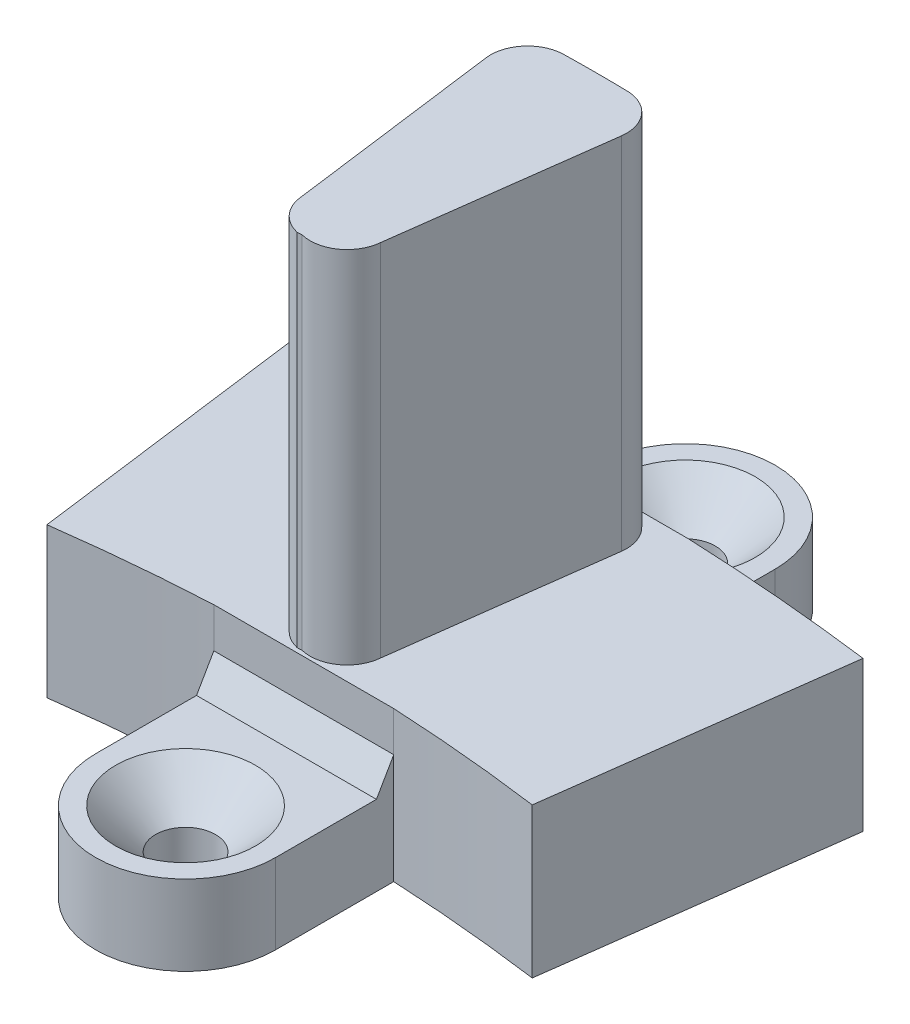
ISO-10303-21;
HEADER;
FILE_DESCRIPTION(('STEP AP214'),'2;1');
FILE_NAME('part.step','',(''),(''),'','','');
FILE_SCHEMA(('AUTOMOTIVE_DESIGN { 1 0 10303 214 1 1 1 1 }'));
ENDSEC;
DATA;
#1=APPLICATION_CONTEXT('core data for automotive mechanical design processes');
#2=APPLICATION_PROTOCOL_DEFINITION('international standard','automotive_design',2000,#1);
#3=PRODUCT_CONTEXT('',#1,'mechanical');
#4=PRODUCT('Part','Part','',(#3));
#5=PRODUCT_RELATED_PRODUCT_CATEGORY('part','',(#4));
#6=PRODUCT_DEFINITION_FORMATION('','',#4);
#7=PRODUCT_DEFINITION_CONTEXT('part definition',#1,'design');
#8=PRODUCT_DEFINITION('design','',#6,#7);
#9=PRODUCT_DEFINITION_SHAPE('','',#8);
#10=(LENGTH_UNIT() NAMED_UNIT(*) SI_UNIT(.MILLI.,.METRE.));
#11=(NAMED_UNIT(*) PLANE_ANGLE_UNIT() SI_UNIT($,.RADIAN.));
#12=(NAMED_UNIT(*) SI_UNIT($,.STERADIAN.) SOLID_ANGLE_UNIT());
#13=UNCERTAINTY_MEASURE_WITH_UNIT(LENGTH_MEASURE(1.E-05),#10,'distance_accuracy_value','');
#14=(GEOMETRIC_REPRESENTATION_CONTEXT(3) GLOBAL_UNCERTAINTY_ASSIGNED_CONTEXT((#13)) GLOBAL_UNIT_ASSIGNED_CONTEXT((#10,
#11,#12)) REPRESENTATION_CONTEXT('',''));
#15=CARTESIAN_POINT('',(0.,0.,0.));
#16=DIRECTION('',(0.,0.,1.));
#17=DIRECTION('',(1.,0.,0.));
#18=AXIS2_PLACEMENT_3D('',#15,#16,#17);
#19=CARTESIAN_POINT('',(0.,3.75,-87.));
#20=DIRECTION('',(0.,1.,0.));
#21=DIRECTION('',(0.,0.,1.));
#22=AXIS2_PLACEMENT_3D('',#19,#20,#21);
#23=PLANE('',#22);
#24=CARTESIAN_POINT('',(0.14,3.75,-94.9379160024427));
#25=DIRECTION('',(0.,1.,0.));
#26=DIRECTION('',(0.,0.,1.));
#27=AXIS2_PLACEMENT_3D('',#24,#25,#26);
#28=CIRCLE('',#27,1.85000000000024);
#29=CARTESIAN_POINT('',(-0.315893801982409,3.75,-93.144968473563));
#30=VERTEX_POINT('',#29);
#31=CARTESIAN_POINT('',(1.98208086134192,3.75,-94.7669244813728));
#32=VERTEX_POINT('',#31);
#33=EDGE_CURVE('E303',#30,#32,#28,.T.);
#34=ORIENTED_EDGE('',*,*,#33,.F.);
#35=CARTESIAN_POINT('',(4.11412982147435,3.75,7.15724930199574));
#36=DIRECTION('',(0.,1.,0.));
#37=DIRECTION('',(0.,0.,1.));
#38=AXIS2_PLACEMENT_3D('',#35,#36,#37);
#39=CIRCLE('',#38,100.4);
#40=CARTESIAN_POINT('',(-0.551584548782107,3.75,-93.1342812946363));
#41=VERTEX_POINT('',#40);
#42=EDGE_CURVE('E452',#41,#30,#39,.F.);
#43=ORIENTED_EDGE('',*,*,#42,.F.);
#44=CARTESIAN_POINT('',(-0.14,3.75,-94.9379160024427));
#45=DIRECTION('',(0.,1.,0.));
#46=DIRECTION('',(0.,0.,1.));
#47=AXIS2_PLACEMENT_3D('',#44,#45,#46);
#48=CIRCLE('',#47,1.85);
#49=CARTESIAN_POINT('',(-1.98208086134192,3.75,-94.7669244813728));
#50=VERTEX_POINT('',#49);
#51=EDGE_CURVE('E449',#50,#41,#48,.T.);
#52=ORIENTED_EDGE('',*,*,#51,.F.);
#53=DIRECTION('',(0.130526192220048,0.,0.991444861373811));
#54=VECTOR('',#53,1.);
#55=CARTESIAN_POINT('',(-0.943197988726568,3.75,-86.8758256290647));
#56=LINE('',#55,#54);
#57=CARTESIAN_POINT('',(-3.38599627207303,3.75,-105.430720736352));
#58=VERTEX_POINT('',#57);
#59=EDGE_CURVE('E446',#58,#50,#56,.T.);
#60=ORIENTED_EDGE('',*,*,#59,.F.);
#61=CARTESIAN_POINT('',(-1.55,3.75,-105.657916002443));
#62=DIRECTION('',(0.,1.,0.));
#63=DIRECTION('',(0.,0.,1.));
#64=AXIS2_PLACEMENT_3D('',#61,#62,#63);
#65=CIRCLE('',#64,1.85);
#66=CARTESIAN_POINT('',(-1.63640185271201,3.75,-107.505897257718));
#67=VERTEX_POINT('',#66);
#68=EDGE_CURVE('E443',#67,#58,#65,.T.);
#69=ORIENTED_EDGE('',*,*,#68,.F.);
#70=CARTESIAN_POINT('',(0.,3.75,-34.9825728980639));
#71=DIRECTION('',(0.,1.,0.));
#72=DIRECTION('',(0.,0.,1.));
#73=AXIS2_PLACEMENT_3D('',#70,#71,#72);
#74=CIRCLE('',#73,72.5417837332328);
#75=CARTESIAN_POINT('',(1.63640185271204,3.75,-107.505897257718));
#76=VERTEX_POINT('',#75);
#77=EDGE_CURVE('E440',#76,#67,#74,.T.);
#78=ORIENTED_EDGE('',*,*,#77,.F.);
#79=CARTESIAN_POINT('',(1.55,3.75,-105.657916002443));
#80=DIRECTION('',(0.,1.,0.));
#81=DIRECTION('',(0.,0.,1.));
#82=AXIS2_PLACEMENT_3D('',#79,#80,#81);
#83=CIRCLE('',#82,1.85);
#84=CARTESIAN_POINT('',(3.38599627207303,3.75,-105.430720736352));
#85=VERTEX_POINT('',#84);
#86=EDGE_CURVE('E437',#85,#76,#83,.T.);
#87=ORIENTED_EDGE('',*,*,#86,.F.);
#88=DIRECTION('',(0.130526192220048,0.,-0.991444861373811));
#89=VECTOR('',#88,1.);
#90=CARTESIAN_POINT('',(0.943197988726566,3.75,-86.8758256290647));
#91=LINE('',#90,#89);
#92=EDGE_CURVE('E421',#32,#85,#91,.T.);
#93=ORIENTED_EDGE('',*,*,#92,.F.);
#94=EDGE_LOOP('',(#34,#43,#52,#60,#69,#78,#87,#93));
#95=FACE_BOUND('',#94,.T.);
#96=CARTESIAN_POINT('',(0.,3.75,-3.02676148835454));
#97=DIRECTION('',(0.,-1.,0.));
#98=DIRECTION('',(0.,0.,1.));
#99=AXIS2_PLACEMENT_3D('',#96,#97,#98);
#100=CIRCLE('',#99,90.);
#101=CARTESIAN_POINT('',(-12.1389358764648,3.75,-92.2043721077644));
#102=VERTEX_POINT('',#101);
#103=CARTESIAN_POINT('',(-4.49999999999997,3.75,-92.9141910878263));
#104=VERTEX_POINT('',#103);
#105=EDGE_CURVE('E319',#102,#104,#100,.T.);
#106=ORIENTED_EDGE('',*,*,#105,.T.);
#107=DIRECTION('',(1.,0.,0.));
#108=VECTOR('',#107,1.);
#109=CARTESIAN_POINT('',(0.,3.75,-92.9141910878263));
#110=LINE('',#109,#108);
#111=CARTESIAN_POINT('',(4.5,3.75,-92.9141910878264));
#112=VERTEX_POINT('',#111);
#113=EDGE_CURVE('E383',#104,#112,#110,.T.);
#114=ORIENTED_EDGE('',*,*,#113,.T.);
#115=CARTESIAN_POINT('',(0.,3.75,-3.02676148835454));
#116=DIRECTION('',(0.,-1.,0.));
#117=DIRECTION('',(0.,0.,1.));
#118=AXIS2_PLACEMENT_3D('',#115,#116,#117);
#119=CIRCLE('',#118,90.);
#120=CARTESIAN_POINT('',(12.1389358764648,3.75,-92.2043721077644));
#121=VERTEX_POINT('',#120);
#122=EDGE_CURVE('E307',#112,#121,#119,.T.);
#123=ORIENTED_EDGE('',*,*,#122,.T.);
#124=DIRECTION('',(0.130526192220052,0.,-0.99144486137381));
#125=VECTOR('',#124,1.);
#126=CARTESIAN_POINT('',(12.1389358764648,3.75,-92.2043721077644));
#127=LINE('',#126,#125);
#128=CARTESIAN_POINT('',(14.0641972117106,3.75,-106.828183813028));
#129=VERTEX_POINT('',#128);
#130=EDGE_CURVE('E309',#121,#129,#127,.T.);
#131=ORIENTED_EDGE('',*,*,#130,.T.);
#132=CARTESIAN_POINT('',(0.,3.75,2.26901301984254));
#133=DIRECTION('',(0.,1.,0.));
#134=DIRECTION('',(0.,0.,1.));
#135=AXIS2_PLACEMENT_3D('',#132,#133,#134);
#136=CIRCLE('',#135,110.);
#137=CARTESIAN_POINT('',(4.50000000000001,3.75,-107.6389029826));
#138=VERTEX_POINT('',#137);
#139=EDGE_CURVE('E312',#129,#138,#136,.T.);
#140=ORIENTED_EDGE('',*,*,#139,.T.);
#141=DIRECTION('',(-1.,0.,0.));
#142=VECTOR('',#141,1.);
#143=CARTESIAN_POINT('',(0.,3.75,-107.6389029826));
#144=LINE('',#143,#142);
#145=CARTESIAN_POINT('',(-4.5,3.75,-107.6389029826));
#146=VERTEX_POINT('',#145);
#147=EDGE_CURVE('E386',#138,#146,#144,.T.);
#148=ORIENTED_EDGE('',*,*,#147,.T.);
#149=CARTESIAN_POINT('',(0.,3.75,2.26901301984254));
#150=DIRECTION('',(0.,1.,0.));
#151=DIRECTION('',(0.,0.,1.));
#152=AXIS2_PLACEMENT_3D('',#149,#150,#151);
#153=CIRCLE('',#152,110.);
#154=CARTESIAN_POINT('',(-14.0641972117106,3.75,-106.828183813028));
#155=VERTEX_POINT('',#154);
#156=EDGE_CURVE('E315',#146,#155,#153,.T.);
#157=ORIENTED_EDGE('',*,*,#156,.T.);
#158=DIRECTION('',(0.130526192220052,0.,0.99144486137381));
#159=VECTOR('',#158,1.);
#160=CARTESIAN_POINT('',(-14.0641972117106,3.75,-106.828183813028));
#161=LINE('',#160,#159);
#162=EDGE_CURVE('E317',#155,#102,#161,.T.);
#163=ORIENTED_EDGE('',*,*,#162,.T.);
#164=EDGE_LOOP('',(#106,#114,#123,#131,#140,#148,#157,#163));
#165=FACE_BOUND('',#164,.T.);
#166=ADVANCED_FACE('F35',(#95,#165),#23,.T.);
#167=CARTESIAN_POINT('',(0.,3.75,-87.));
#168=DIRECTION('',(0.,-1.,0.));
#169=DIRECTION('',(0.,0.,-1.));
#170=AXIS2_PLACEMENT_3D('',#167,#168,#169);
#171=CYLINDRICAL_SURFACE('',#170,4.5);
#172=CARTESIAN_POINT('',(0.,0.25,-87.));
#173=DIRECTION('',(0.,1.,0.));
#174=DIRECTION('',(0.,0.,1.));
#175=AXIS2_PLACEMENT_3D('',#172,#173,#174);
#176=CIRCLE('',#175,4.5);
#177=CARTESIAN_POINT('',(-4.5,0.25,-87.));
#178=VERTEX_POINT('',#177);
#179=CARTESIAN_POINT('',(4.5,0.25,-87.));
#180=VERTEX_POINT('',#179);
#181=EDGE_CURVE('E394',#178,#180,#176,.T.);
#182=ORIENTED_EDGE('',*,*,#181,.F.);
#183=DIRECTION('',(0.,-1.,0.));
#184=VECTOR('',#183,1.);
#185=CARTESIAN_POINT('',(-4.5,3.75,-87.));
#186=LINE('',#185,#184);
#187=CARTESIAN_POINT('',(-4.5,-3.75,-87.));
#188=VERTEX_POINT('',#187);
#189=EDGE_CURVE('E321',#178,#188,#186,.T.);
#190=ORIENTED_EDGE('',*,*,#189,.T.);
#191=CARTESIAN_POINT('',(0.,-3.75,-87.));
#192=DIRECTION('',(0.,1.,0.));
#193=DIRECTION('',(0.,0.,1.));
#194=AXIS2_PLACEMENT_3D('',#191,#192,#193);
#195=CIRCLE('',#194,4.5);
#196=CARTESIAN_POINT('',(4.5,-3.75,-87.));
#197=VERTEX_POINT('',#196);
#198=EDGE_CURVE('E296',#188,#197,#195,.T.);
#199=ORIENTED_EDGE('',*,*,#198,.T.);
#200=DIRECTION('',(0.,-1.,0.));
#201=VECTOR('',#200,1.);
#202=CARTESIAN_POINT('',(4.5,3.75,-87.));
#203=LINE('',#202,#201);
#204=EDGE_CURVE('E244',#180,#197,#203,.T.);
#205=ORIENTED_EDGE('',*,*,#204,.F.);
#206=EDGE_LOOP('',(#182,#190,#199,#205));
#207=FACE_BOUND('',#206,.T.);
#208=ADVANCED_FACE('F498',(#207),#171,.T.);
#209=CARTESIAN_POINT('',(4.5,3.75,-90.6054837798056));
#210=DIRECTION('',(-1.,0.,0.));
#211=DIRECTION('',(0.,0.,1.));
#212=AXIS2_PLACEMENT_3D('',#209,#210,#211);
#213=PLANE('',#212);
#214=DIRECTION('',(0.,0.,-1.));
#215=VECTOR('',#214,1.);
#216=CARTESIAN_POINT('',(4.5,0.25,-87.0325559207924));
#217=LINE('',#216,#215);
#218=CARTESIAN_POINT('',(4.50000000000002,0.25,-92.0481656840419));
#219=VERTEX_POINT('',#218);
#220=EDGE_CURVE('E580',#180,#219,#217,.T.);
#221=ORIENTED_EDGE('',*,*,#220,.F.);
#222=ORIENTED_EDGE('',*,*,#204,.T.);
#223=DIRECTION('',(0.,0.,-1.));
#224=VECTOR('',#223,1.);
#225=CARTESIAN_POINT('',(4.5,-3.75,-90.6054837798056));
#226=LINE('',#225,#224);
#227=CARTESIAN_POINT('',(4.5,-3.75,-92.9141910878264));
#228=VERTEX_POINT('',#227);
#229=EDGE_CURVE('E300',#197,#228,#226,.T.);
#230=ORIENTED_EDGE('',*,*,#229,.T.);
#231=DIRECTION('',(0.,-1.,0.));
#232=VECTOR('',#231,1.);
#233=CARTESIAN_POINT('',(4.5,3.75,-92.9141910878264));
#234=LINE('',#233,#232);
#235=CARTESIAN_POINT('',(4.5,1.75000000000001,-92.9141910878264));
#236=VERTEX_POINT('',#235);
#237=EDGE_CURVE('E240',#236,#228,#234,.T.);
#238=ORIENTED_EDGE('',*,*,#237,.F.);
#239=DIRECTION('',(0.,0.866025403784437,-0.500000000000003));
#240=VECTOR('',#239,1.);
#241=CARTESIAN_POINT('',(4.5,2.2503004106756,-93.2030396646056));
#242=LINE('',#241,#240);
#243=EDGE_CURVE('E11',#236,#219,#242,.F.);
#244=ORIENTED_EDGE('',*,*,#243,.T.);
#245=EDGE_LOOP('',(#221,#222,#230,#238,#244));
#246=FACE_BOUND('',#245,.T.);
#247=ADVANCED_FACE('F503',(#246),#213,.F.);
#248=CARTESIAN_POINT('',(-4.5,3.75,-87.));
#249=DIRECTION('',(1.,0.,0.));
#250=DIRECTION('',(0.,0.,-1.));
#251=AXIS2_PLACEMENT_3D('',#248,#249,#250);
#252=PLANE('',#251);
#253=DIRECTION('',(0.,0.,1.));
#254=VECTOR('',#253,1.);
#255=CARTESIAN_POINT('',(-4.5,0.25,-91.3936529381923));
#256=LINE('',#255,#254);
#257=CARTESIAN_POINT('',(-4.49999999999999,0.25,-92.0481656840419));
#258=VERTEX_POINT('',#257);
#259=EDGE_CURVE('E585',#258,#178,#256,.T.);
#260=ORIENTED_EDGE('',*,*,#259,.F.);
#261=DIRECTION('',(0.,-0.866025403784437,0.500000000000003));
#262=VECTOR('',#261,1.);
#263=CARTESIAN_POINT('',(-4.49999999999999,0.689080137553425,-92.3016687196542));
#264=LINE('',#263,#262);
#265=CARTESIAN_POINT('',(-4.49999999999997,1.75000000000001,-92.9141910878263));
#266=VERTEX_POINT('',#265);
#267=EDGE_CURVE('E47',#258,#266,#264,.F.);
#268=ORIENTED_EDGE('',*,*,#267,.T.);
#269=DIRECTION('',(0.,-1.,0.));
#270=VECTOR('',#269,1.);
#271=CARTESIAN_POINT('',(-4.49999999999997,3.75,-92.9141910878263));
#272=LINE('',#271,#270);
#273=CARTESIAN_POINT('',(-4.49999999999997,-3.75,-92.9141910878263));
#274=VERTEX_POINT('',#273);
#275=EDGE_CURVE('E347',#266,#274,#272,.T.);
#276=ORIENTED_EDGE('',*,*,#275,.T.);
#277=DIRECTION('',(0.,0.,1.));
#278=VECTOR('',#277,1.);
#279=CARTESIAN_POINT('',(-4.5,-3.75,-87.));
#280=LINE('',#279,#278);
#281=EDGE_CURVE('E310',#274,#188,#280,.T.);
#282=ORIENTED_EDGE('',*,*,#281,.T.);
#283=ORIENTED_EDGE('',*,*,#189,.F.);
#284=EDGE_LOOP('',(#260,#268,#276,#282,#283));
#285=FACE_BOUND('',#284,.T.);
#286=ADVANCED_FACE('F512',(#285),#252,.F.);
#287=CARTESIAN_POINT('',(0.,3.75,-87.));
#288=DIRECTION('',(0.,-1.,0.));
#289=DIRECTION('',(0.,0.,-1.));
#290=AXIS2_PLACEMENT_3D('',#287,#288,#289);
#291=CYLINDRICAL_SURFACE('',#290,1.5);
#292=CARTESIAN_POINT('',(0.,-1.75000000000001,-87.));
#293=DIRECTION('',(0.,1.,0.));
#294=DIRECTION('',(0.,0.,1.));
#295=AXIS2_PLACEMENT_3D('',#292,#293,#294);
#296=CIRCLE('',#295,1.5);
#297=CARTESIAN_POINT('',(0.,-1.75000000000001,-85.5));
#298=VERTEX_POINT('',#297);
#299=EDGE_CURVE('E246',#298,#298,#296,.T.);
#300=ORIENTED_EDGE('',*,*,#299,.T.);
#301=EDGE_LOOP('',(#300));
#302=FACE_BOUND('',#301,.T.);
#303=CARTESIAN_POINT('',(0.,-3.75,-87.));
#304=DIRECTION('',(0.,1.,0.));
#305=DIRECTION('',(0.,0.,-1.));
#306=AXIS2_PLACEMENT_3D('',#303,#304,#305);
#307=CIRCLE('',#306,1.5);
#308=CARTESIAN_POINT('',(0.,-3.75,-88.5));
#309=VERTEX_POINT('',#308);
#310=EDGE_CURVE('E297',#309,#309,#307,.T.);
#311=ORIENTED_EDGE('',*,*,#310,.F.);
#312=EDGE_LOOP('',(#311));
#313=FACE_BOUND('',#312,.T.);
#314=ADVANCED_FACE('F511',(#302,#313),#291,.F.);
#315=CARTESIAN_POINT('',(0.,-3.75,-87.));
#316=DIRECTION('',(0.,1.,0.));
#317=DIRECTION('',(0.,0.,1.));
#318=AXIS2_PLACEMENT_3D('',#315,#316,#317);
#319=PLANE('',#318);
#320=ORIENTED_EDGE('',*,*,#198,.F.);
#321=ORIENTED_EDGE('',*,*,#281,.F.);
#322=CARTESIAN_POINT('',(0.,-3.75,-3.02676148835454));
#323=DIRECTION('',(0.,-1.,0.));
#324=DIRECTION('',(0.,0.,1.));
#325=AXIS2_PLACEMENT_3D('',#322,#323,#324);
#326=CIRCLE('',#325,90.);
#327=CARTESIAN_POINT('',(-12.1389358764648,-3.75,-92.2043721077644));
#328=VERTEX_POINT('',#327);
#329=EDGE_CURVE('E341',#328,#274,#326,.T.);
#330=ORIENTED_EDGE('',*,*,#329,.F.);
#331=DIRECTION('',(0.130526192220052,0.,0.99144486137381));
#332=VECTOR('',#331,1.);
#333=CARTESIAN_POINT('',(-14.0641972117106,-3.75,-106.828183813028));
#334=LINE('',#333,#332);
#335=CARTESIAN_POINT('',(-14.0641972117106,-3.75,-106.828183813028));
#336=VERTEX_POINT('',#335);
#337=EDGE_CURVE('E339',#336,#328,#334,.T.);
#338=ORIENTED_EDGE('',*,*,#337,.F.);
#339=CARTESIAN_POINT('',(0.,-3.75,2.26901301984254));
#340=DIRECTION('',(0.,1.,0.));
#341=DIRECTION('',(0.,0.,1.));
#342=AXIS2_PLACEMENT_3D('',#339,#340,#341);
#343=CIRCLE('',#342,110.);
#344=CARTESIAN_POINT('',(-4.5,-3.75,-107.6389029826));
#345=VERTEX_POINT('',#344);
#346=EDGE_CURVE('E337',#345,#336,#343,.T.);
#347=ORIENTED_EDGE('',*,*,#346,.F.);
#348=DIRECTION('',(0.,0.,1.));
#349=VECTOR('',#348,1.);
#350=CARTESIAN_POINT('',(-4.50000000000001,-3.75,-109.907916002443));
#351=LINE('',#350,#349);
#352=CARTESIAN_POINT('',(-4.5,-3.75,-112.));
#353=VERTEX_POINT('',#352);
#354=EDGE_CURVE('E334',#353,#345,#351,.T.);
#355=ORIENTED_EDGE('',*,*,#354,.F.);
#356=CARTESIAN_POINT('',(0.,-3.75,-112.));
#357=DIRECTION('',(0.,1.,0.));
#358=DIRECTION('',(0.,0.,-1.));
#359=AXIS2_PLACEMENT_3D('',#356,#357,#358);
#360=CIRCLE('',#359,4.5);
#361=CARTESIAN_POINT('',(4.5,-3.75,-112.));
#362=VERTEX_POINT('',#361);
#363=EDGE_CURVE('E332',#362,#353,#360,.T.);
#364=ORIENTED_EDGE('',*,*,#363,.F.);
#365=DIRECTION('',(0.,0.,-1.));
#366=VECTOR('',#365,1.);
#367=CARTESIAN_POINT('',(4.5,-3.75,-112.));
#368=LINE('',#367,#366);
#369=CARTESIAN_POINT('',(4.50000000000001,-3.75,-107.6389029826));
#370=VERTEX_POINT('',#369);
#371=EDGE_CURVE('E225',#370,#362,#368,.T.);
#372=ORIENTED_EDGE('',*,*,#371,.F.);
#373=CARTESIAN_POINT('',(0.,-3.75,2.26901301984254));
#374=DIRECTION('',(0.,1.,0.));
#375=DIRECTION('',(0.,0.,1.));
#376=AXIS2_PLACEMENT_3D('',#373,#374,#375);
#377=CIRCLE('',#376,110.);
#378=CARTESIAN_POINT('',(14.0641972117106,-3.75,-106.828183813028));
#379=VERTEX_POINT('',#378);
#380=EDGE_CURVE('E329',#379,#370,#377,.T.);
#381=ORIENTED_EDGE('',*,*,#380,.F.);
#382=DIRECTION('',(0.130526192220052,0.,-0.99144486137381));
#383=VECTOR('',#382,1.);
#384=CARTESIAN_POINT('',(12.1389358764648,-3.75,-92.2043721077644));
#385=LINE('',#384,#383);
#386=CARTESIAN_POINT('',(12.1389358764648,-3.75,-92.2043721077644));
#387=VERTEX_POINT('',#386);
#388=EDGE_CURVE('E327',#387,#379,#385,.T.);
#389=ORIENTED_EDGE('',*,*,#388,.F.);
#390=CARTESIAN_POINT('',(0.,-3.75,-3.02676148835454));
#391=DIRECTION('',(0.,-1.,0.));
#392=DIRECTION('',(0.,0.,1.));
#393=AXIS2_PLACEMENT_3D('',#390,#391,#392);
#394=CIRCLE('',#393,90.);
#395=EDGE_CURVE('E325',#228,#387,#394,.T.);
#396=ORIENTED_EDGE('',*,*,#395,.F.);
#397=ORIENTED_EDGE('',*,*,#229,.F.);
#398=EDGE_LOOP('',(#320,#321,#330,#338,#347,#355,#364,#372,#381,#389,#396,#397));
#399=FACE_BOUND('',#398,.T.);
#400=CARTESIAN_POINT('',(0.,-3.75,-112.));
#401=DIRECTION('',(0.,1.,0.));
#402=DIRECTION('',(0.,0.,1.));
#403=AXIS2_PLACEMENT_3D('',#400,#401,#402);
#404=CIRCLE('',#403,1.5);
#405=CARTESIAN_POINT('',(0.,-3.75,-110.5));
#406=VERTEX_POINT('',#405);
#407=EDGE_CURVE('E294',#406,#406,#404,.T.);
#408=ORIENTED_EDGE('',*,*,#407,.T.);
#409=EDGE_LOOP('',(#408));
#410=FACE_BOUND('',#409,.T.);
#411=ORIENTED_EDGE('',*,*,#310,.T.);
#412=EDGE_LOOP('',(#411));
#413=FACE_BOUND('',#412,.T.);
#414=ADVANCED_FACE('F371',(#399,#410,#413),#319,.F.);
#415=CARTESIAN_POINT('',(0.,3.75,-3.02676148835454));
#416=DIRECTION('',(0.,-1.,0.));
#417=DIRECTION('',(0.,0.,-1.));
#418=AXIS2_PLACEMENT_3D('',#415,#416,#417);
#419=CYLINDRICAL_SURFACE('',#418,90.);
#420=ORIENTED_EDGE('',*,*,#395,.T.);
#421=DIRECTION('',(0.,-1.,0.));
#422=VECTOR('',#421,1.);
#423=CARTESIAN_POINT('',(12.1389358764648,3.75,-92.2043721077644));
#424=LINE('',#423,#422);
#425=EDGE_CURVE('E237',#121,#387,#424,.T.);
#426=ORIENTED_EDGE('',*,*,#425,.F.);
#427=ORIENTED_EDGE('',*,*,#122,.F.);
#428=EDGE_CURVE('E241',#112,#236,#234,.T.);
#429=ORIENTED_EDGE('',*,*,#428,.T.);
#430=ORIENTED_EDGE('',*,*,#237,.T.);
#431=EDGE_LOOP('',(#420,#426,#427,#429,#430));
#432=FACE_BOUND('',#431,.T.);
#433=ADVANCED_FACE('F510',(#432),#419,.F.);
#434=CARTESIAN_POINT('',(12.1389358764648,3.75,-92.2043721077644));
#435=DIRECTION('',(-0.99144486137381,0.,-0.130526192220052));
#436=DIRECTION('',(-0.130526192220052,0.,0.99144486137381));
#437=AXIS2_PLACEMENT_3D('',#434,#435,#436);
#438=PLANE('',#437);
#439=ORIENTED_EDGE('',*,*,#388,.T.);
#440=DIRECTION('',(0.,-1.,0.));
#441=VECTOR('',#440,1.);
#442=CARTESIAN_POINT('',(14.0641972117106,3.75,-106.828183813028));
#443=LINE('',#442,#441);
#444=EDGE_CURVE('E234',#129,#379,#443,.T.);
#445=ORIENTED_EDGE('',*,*,#444,.F.);
#446=ORIENTED_EDGE('',*,*,#130,.F.);
#447=ORIENTED_EDGE('',*,*,#425,.T.);
#448=EDGE_LOOP('',(#439,#445,#446,#447));
#449=FACE_BOUND('',#448,.T.);
#450=ADVANCED_FACE('F531',(#449),#438,.F.);
#451=CARTESIAN_POINT('',(0.,3.75,2.26901301984254));
#452=DIRECTION('',(0.,-1.,0.));
#453=DIRECTION('',(0.,0.,-1.));
#454=AXIS2_PLACEMENT_3D('',#451,#452,#453);
#455=CYLINDRICAL_SURFACE('',#454,110.);
#456=ORIENTED_EDGE('',*,*,#380,.T.);
#457=DIRECTION('',(0.,-1.,0.));
#458=VECTOR('',#457,1.);
#459=CARTESIAN_POINT('',(4.50000000000001,3.75,-107.6389029826));
#460=LINE('',#459,#458);
#461=CARTESIAN_POINT('',(4.50000000000001,1.75000000000001,-107.6389029826));
#462=VERTEX_POINT('',#461);
#463=EDGE_CURVE('E55',#462,#370,#460,.T.);
#464=ORIENTED_EDGE('',*,*,#463,.F.);
#465=EDGE_CURVE('E228',#138,#462,#460,.T.);
#466=ORIENTED_EDGE('',*,*,#465,.F.);
#467=ORIENTED_EDGE('',*,*,#139,.F.);
#468=ORIENTED_EDGE('',*,*,#444,.T.);
#469=EDGE_LOOP('',(#456,#464,#466,#467,#468));
#470=FACE_BOUND('',#469,.T.);
#471=ADVANCED_FACE('F528',(#470),#455,.T.);
#472=CARTESIAN_POINT('',(4.5,3.75,-112.));
#473=DIRECTION('',(-1.,0.,0.));
#474=DIRECTION('',(0.,0.,1.));
#475=AXIS2_PLACEMENT_3D('',#472,#473,#474);
#476=PLANE('',#475);
#477=DIRECTION('',(0.,-1.,0.));
#478=VECTOR('',#477,1.);
#479=CARTESIAN_POINT('',(4.5,3.75,-112.));
#480=LINE('',#479,#478);
#481=CARTESIAN_POINT('',(4.5,0.25,-112.));
#482=VERTEX_POINT('',#481);
#483=EDGE_CURVE('E218',#482,#362,#480,.T.);
#484=ORIENTED_EDGE('',*,*,#483,.F.);
#485=DIRECTION('',(0.,0.,-1.));
#486=VECTOR('',#485,1.);
#487=CARTESIAN_POINT('',(4.5,0.25,-112.));
#488=LINE('',#487,#486);
#489=CARTESIAN_POINT('',(4.50000000000001,0.25,-108.504928386385));
#490=VERTEX_POINT('',#489);
#491=EDGE_CURVE('E200',#490,#482,#488,.T.);
#492=ORIENTED_EDGE('',*,*,#491,.F.);
#493=DIRECTION('',(0.,0.866025403784437,0.500000000000004));
#494=VECTOR('',#493,1.);
#495=CARTESIAN_POINT('',(4.5,1.36158959728159,-107.863151833166));
#496=LINE('',#495,#494);
#497=EDGE_CURVE('E277',#490,#462,#496,.T.);
#498=ORIENTED_EDGE('',*,*,#497,.T.);
#499=ORIENTED_EDGE('',*,*,#463,.T.);
#500=ORIENTED_EDGE('',*,*,#371,.T.);
#501=EDGE_LOOP('',(#484,#492,#498,#499,#500));
#502=FACE_BOUND('',#501,.T.);
#503=ADVANCED_FACE('F223',(#502),#476,.F.);
#504=CARTESIAN_POINT('',(0.,3.75,-112.));
#505=DIRECTION('',(0.,-1.,0.));
#506=DIRECTION('',(0.,0.,-1.));
#507=AXIS2_PLACEMENT_3D('',#504,#505,#506);
#508=CYLINDRICAL_SURFACE('',#507,4.5);
#509=DIRECTION('',(0.,-1.,0.));
#510=VECTOR('',#509,1.);
#511=CARTESIAN_POINT('',(-4.5,3.75,-112.));
#512=LINE('',#511,#510);
#513=CARTESIAN_POINT('',(-4.5,0.25,-112.));
#514=VERTEX_POINT('',#513);
#515=EDGE_CURVE('E220',#514,#353,#512,.T.);
#516=ORIENTED_EDGE('',*,*,#515,.F.);
#517=CARTESIAN_POINT('',(0.,0.25,-112.));
#518=DIRECTION('',(0.,1.,0.));
#519=DIRECTION('',(0.,0.,-1.));
#520=AXIS2_PLACEMENT_3D('',#517,#518,#519);
#521=CIRCLE('',#520,4.5);
#522=EDGE_CURVE('E204',#482,#514,#521,.T.);
#523=ORIENTED_EDGE('',*,*,#522,.F.);
#524=ORIENTED_EDGE('',*,*,#483,.T.);
#525=ORIENTED_EDGE('',*,*,#363,.T.);
#526=EDGE_LOOP('',(#516,#523,#524,#525));
#527=FACE_BOUND('',#526,.T.);
#528=ADVANCED_FACE('F216',(#527),#508,.T.);
#529=CARTESIAN_POINT('',(-4.50000000000001,3.75,-109.907916002443));
#530=DIRECTION('',(1.,0.,0.));
#531=DIRECTION('',(0.,0.,-1.));
#532=AXIS2_PLACEMENT_3D('',#529,#530,#531);
#533=PLANE('',#532);
#534=DIRECTION('',(0.,-1.,0.));
#535=VECTOR('',#534,1.);
#536=CARTESIAN_POINT('',(-4.5,3.75,-107.6389029826));
#537=LINE('',#536,#535);
#538=CARTESIAN_POINT('',(-4.5,1.75000000000001,-107.6389029826));
#539=VERTEX_POINT('',#538);
#540=EDGE_CURVE('E356',#539,#345,#537,.T.);
#541=ORIENTED_EDGE('',*,*,#540,.F.);
#542=DIRECTION('',(0.,-0.866025403784437,-0.500000000000004));
#543=VECTOR('',#542,1.);
#544=CARTESIAN_POINT('',(-4.5,2.26748854164935,-107.340130833776));
#545=LINE('',#544,#543);
#546=CARTESIAN_POINT('',(-4.5,0.25,-108.504928386385));
#547=VERTEX_POINT('',#546);
#548=EDGE_CURVE('E565',#539,#547,#545,.T.);
#549=ORIENTED_EDGE('',*,*,#548,.T.);
#550=DIRECTION('',(0.,0.,1.));
#551=VECTOR('',#550,1.);
#552=CARTESIAN_POINT('',(-4.5,0.25,-107.6389029826));
#553=LINE('',#552,#551);
#554=EDGE_CURVE('E221',#514,#547,#553,.T.);
#555=ORIENTED_EDGE('',*,*,#554,.F.);
#556=ORIENTED_EDGE('',*,*,#515,.T.);
#557=ORIENTED_EDGE('',*,*,#354,.T.);
#558=EDGE_LOOP('',(#541,#549,#555,#556,#557));
#559=FACE_BOUND('',#558,.T.);
#560=ADVANCED_FACE('F367',(#559),#533,.F.);
#561=CARTESIAN_POINT('',(0.,3.75,2.26901301984254));
#562=DIRECTION('',(0.,-1.,0.));
#563=DIRECTION('',(0.,0.,-1.));
#564=AXIS2_PLACEMENT_3D('',#561,#562,#563);
#565=CYLINDRICAL_SURFACE('',#564,110.);
#566=ORIENTED_EDGE('',*,*,#346,.T.);
#567=DIRECTION('',(0.,-1.,0.));
#568=VECTOR('',#567,1.);
#569=CARTESIAN_POINT('',(-14.0641972117106,3.75,-106.828183813028));
#570=LINE('',#569,#568);
#571=EDGE_CURVE('E354',#155,#336,#570,.T.);
#572=ORIENTED_EDGE('',*,*,#571,.F.);
#573=ORIENTED_EDGE('',*,*,#156,.F.);
#574=EDGE_CURVE('E230',#146,#539,#537,.T.);
#575=ORIENTED_EDGE('',*,*,#574,.T.);
#576=ORIENTED_EDGE('',*,*,#540,.T.);
#577=EDGE_LOOP('',(#566,#572,#573,#575,#576));
#578=FACE_BOUND('',#577,.T.);
#579=ADVANCED_FACE('F361',(#578),#565,.T.);
#580=CARTESIAN_POINT('',(-14.0641972117106,3.75,-106.828183813028));
#581=DIRECTION('',(0.99144486137381,0.,-0.130526192220052));
#582=DIRECTION('',(-0.130526192220052,0.,-0.99144486137381));
#583=AXIS2_PLACEMENT_3D('',#580,#581,#582);
#584=PLANE('',#583);
#585=ORIENTED_EDGE('',*,*,#337,.T.);
#586=DIRECTION('',(0.,-1.,0.));
#587=VECTOR('',#586,1.);
#588=CARTESIAN_POINT('',(-12.1389358764648,3.75,-92.2043721077644));
#589=LINE('',#588,#587);
#590=EDGE_CURVE('E351',#102,#328,#589,.T.);
#591=ORIENTED_EDGE('',*,*,#590,.F.);
#592=ORIENTED_EDGE('',*,*,#162,.F.);
#593=ORIENTED_EDGE('',*,*,#571,.T.);
#594=EDGE_LOOP('',(#585,#591,#592,#593));
#595=FACE_BOUND('',#594,.T.);
#596=ADVANCED_FACE('F376',(#595),#584,.F.);
#597=CARTESIAN_POINT('',(0.,3.75,-3.02676148835454));
#598=DIRECTION('',(0.,-1.,0.));
#599=DIRECTION('',(0.,0.,-1.));
#600=AXIS2_PLACEMENT_3D('',#597,#598,#599);
#601=CYLINDRICAL_SURFACE('',#600,90.);
#602=ORIENTED_EDGE('',*,*,#329,.T.);
#603=ORIENTED_EDGE('',*,*,#275,.F.);
#604=EDGE_CURVE('E348',#104,#266,#272,.T.);
#605=ORIENTED_EDGE('',*,*,#604,.F.);
#606=ORIENTED_EDGE('',*,*,#105,.F.);
#607=ORIENTED_EDGE('',*,*,#590,.T.);
#608=EDGE_LOOP('',(#602,#603,#605,#606,#607));
#609=FACE_BOUND('',#608,.T.);
#610=ADVANCED_FACE('F290',(#609),#601,.F.);
#611=CARTESIAN_POINT('',(0.,3.75,-112.));
#612=DIRECTION('',(0.,-1.,0.));
#613=DIRECTION('',(0.,0.,-1.));
#614=AXIS2_PLACEMENT_3D('',#611,#612,#613);
#615=CYLINDRICAL_SURFACE('',#614,1.5);
#616=CARTESIAN_POINT('',(0.,-1.75000000000001,-112.));
#617=DIRECTION('',(0.,-1.,0.));
#618=DIRECTION('',(0.,0.,-1.));
#619=AXIS2_PLACEMENT_3D('',#616,#617,#618);
#620=CIRCLE('',#619,1.5);
#621=CARTESIAN_POINT('',(0.,-1.75000000000001,-113.5));
#622=VERTEX_POINT('',#621);
#623=EDGE_CURVE('E252',#622,#622,#620,.F.);
#624=ORIENTED_EDGE('',*,*,#623,.T.);
#625=EDGE_LOOP('',(#624));
#626=FACE_BOUND('',#625,.T.);
#627=ORIENTED_EDGE('',*,*,#407,.F.);
#628=EDGE_LOOP('',(#627));
#629=FACE_BOUND('',#628,.T.);
#630=ADVANCED_FACE('F286',(#626,#629),#615,.F.);
#631=CARTESIAN_POINT('',(0.14,-19.7077823656808,-94.9379160024427));
#632=DIRECTION('',(0.,1.,0.));
#633=DIRECTION('',(0.,0.,1.));
#634=AXIS2_PLACEMENT_3D('',#631,#632,#633);
#635=CYLINDRICAL_SURFACE('',#634,1.85000000000024);
#636=DIRECTION('',(0.,1.,0.));
#637=VECTOR('',#636,1.);
#638=CARTESIAN_POINT('',(-0.31589380198241,-19.7077823656808,-93.144968473563));
#639=LINE('',#638,#637);
#640=CARTESIAN_POINT('',(-0.31589380198241,21.75,-93.144968473563));
#641=VERTEX_POINT('',#640);
#642=EDGE_CURVE('E419',#30,#641,#639,.T.);
#643=ORIENTED_EDGE('',*,*,#642,.F.);
#644=ORIENTED_EDGE('',*,*,#33,.T.);
#645=DIRECTION('',(0.,1.,0.));
#646=VECTOR('',#645,1.);
#647=CARTESIAN_POINT('',(1.98208086134192,-19.7077823656808,-94.7669244813728));
#648=LINE('',#647,#646);
#649=CARTESIAN_POINT('',(1.98208086134192,21.75,-94.7669244813728));
#650=VERTEX_POINT('',#649);
#651=EDGE_CURVE('E418',#32,#650,#648,.T.);
#652=ORIENTED_EDGE('',*,*,#651,.T.);
#653=CARTESIAN_POINT('',(0.14,21.75,-94.9379160024427));
#654=DIRECTION('',(0.,1.,0.));
#655=DIRECTION('',(0.,0.,1.));
#656=AXIS2_PLACEMENT_3D('',#653,#654,#655);
#657=CIRCLE('',#656,1.85000000000024);
#658=EDGE_CURVE('E389',#641,#650,#657,.T.);
#659=ORIENTED_EDGE('',*,*,#658,.F.);
#660=EDGE_LOOP('',(#643,#644,#652,#659));
#661=FACE_BOUND('',#660,.T.);
#662=ADVANCED_FACE('F289',(#661),#635,.T.);
#663=CARTESIAN_POINT('',(4.11412982147435,-19.7077823656808,7.15724930199574));
#664=DIRECTION('',(0.,1.,0.));
#665=DIRECTION('',(0.,0.,1.));
#666=AXIS2_PLACEMENT_3D('',#663,#664,#665);
#667=CYLINDRICAL_SURFACE('',#666,100.4);
#668=DIRECTION('',(0.,1.,0.));
#669=VECTOR('',#668,1.);
#670=CARTESIAN_POINT('',(-0.551584548782106,-19.7077823656808,-93.1342812946363));
#671=LINE('',#670,#669);
#672=CARTESIAN_POINT('',(-0.551584548782106,21.75,-93.1342812946363));
#673=VERTEX_POINT('',#672);
#674=EDGE_CURVE('E422',#41,#673,#671,.T.);
#675=ORIENTED_EDGE('',*,*,#674,.F.);
#676=ORIENTED_EDGE('',*,*,#42,.T.);
#677=ORIENTED_EDGE('',*,*,#642,.T.);
#678=CARTESIAN_POINT('',(4.11412982147435,21.75,7.15724930199574));
#679=DIRECTION('',(0.,-1.,0.));
#680=DIRECTION('',(0.,0.,1.));
#681=AXIS2_PLACEMENT_3D('',#678,#679,#680);
#682=CIRCLE('',#681,100.4);
#683=EDGE_CURVE('E415',#673,#641,#682,.T.);
#684=ORIENTED_EDGE('',*,*,#683,.F.);
#685=EDGE_LOOP('',(#675,#676,#677,#684));
#686=FACE_BOUND('',#685,.T.);
#687=ADVANCED_FACE('F471',(#686),#667,.F.);
#688=CARTESIAN_POINT('',(-0.14,-19.7077823656808,-94.9379160024427));
#689=DIRECTION('',(0.,1.,0.));
#690=DIRECTION('',(0.,0.,1.));
#691=AXIS2_PLACEMENT_3D('',#688,#689,#690);
#692=CYLINDRICAL_SURFACE('',#691,1.85);
#693=DIRECTION('',(0.,1.,0.));
#694=VECTOR('',#693,1.);
#695=CARTESIAN_POINT('',(-1.98208086134192,-19.7077823656808,-94.7669244813728));
#696=LINE('',#695,#694);
#697=CARTESIAN_POINT('',(-1.98208086134192,21.75,-94.7669244813728));
#698=VERTEX_POINT('',#697);
#699=EDGE_CURVE('E424',#50,#698,#696,.T.);
#700=ORIENTED_EDGE('',*,*,#699,.F.);
#701=ORIENTED_EDGE('',*,*,#51,.T.);
#702=ORIENTED_EDGE('',*,*,#674,.T.);
#703=CARTESIAN_POINT('',(-0.14,21.75,-94.9379160024427));
#704=DIRECTION('',(0.,1.,0.));
#705=DIRECTION('',(0.,0.,1.));
#706=AXIS2_PLACEMENT_3D('',#703,#704,#705);
#707=CIRCLE('',#706,1.85);
#708=EDGE_CURVE('E412',#698,#673,#707,.T.);
#709=ORIENTED_EDGE('',*,*,#708,.F.);
#710=EDGE_LOOP('',(#700,#701,#702,#709));
#711=FACE_BOUND('',#710,.T.);
#712=ADVANCED_FACE('F474',(#711),#692,.T.);
#713=CARTESIAN_POINT('',(-3.38599627207303,-19.7077823656808,-105.430720736352));
#714=DIRECTION('',(-0.991444861373811,0.,0.130526192220048));
#715=DIRECTION('',(0.130526192220048,0.,0.991444861373811));
#716=AXIS2_PLACEMENT_3D('',#713,#714,#715);
#717=PLANE('',#716);
#718=DIRECTION('',(0.,1.,0.));
#719=VECTOR('',#718,1.);
#720=CARTESIAN_POINT('',(-3.38599627207303,-19.7077823656808,-105.430720736352));
#721=LINE('',#720,#719);
#722=CARTESIAN_POINT('',(-3.38599627207303,21.75,-105.430720736352));
#723=VERTEX_POINT('',#722);
#724=EDGE_CURVE('E426',#58,#723,#721,.T.);
#725=ORIENTED_EDGE('',*,*,#724,.F.);
#726=ORIENTED_EDGE('',*,*,#59,.T.);
#727=ORIENTED_EDGE('',*,*,#699,.T.);
#728=DIRECTION('',(0.130526192220047,0.,0.991444861373811));
#729=VECTOR('',#728,1.);
#730=CARTESIAN_POINT('',(-3.38599627207303,21.75,-105.430720736352));
#731=LINE('',#730,#729);
#732=EDGE_CURVE('E409',#723,#698,#731,.T.);
#733=ORIENTED_EDGE('',*,*,#732,.F.);
#734=EDGE_LOOP('',(#725,#726,#727,#733));
#735=FACE_BOUND('',#734,.T.);
#736=ADVANCED_FACE('F478',(#735),#717,.T.);
#737=CARTESIAN_POINT('',(-1.55,-19.7077823656808,-105.657916002443));
#738=DIRECTION('',(0.,1.,0.));
#739=DIRECTION('',(0.,0.,1.));
#740=AXIS2_PLACEMENT_3D('',#737,#738,#739);
#741=CYLINDRICAL_SURFACE('',#740,1.85);
#742=DIRECTION('',(0.,1.,0.));
#743=VECTOR('',#742,1.);
#744=CARTESIAN_POINT('',(-1.63640185271201,-19.7077823656808,-107.505897257718));
#745=LINE('',#744,#743);
#746=CARTESIAN_POINT('',(-1.63640185271201,21.75,-107.505897257718));
#747=VERTEX_POINT('',#746);
#748=EDGE_CURVE('E428',#67,#747,#745,.T.);
#749=ORIENTED_EDGE('',*,*,#748,.F.);
#750=ORIENTED_EDGE('',*,*,#68,.T.);
#751=ORIENTED_EDGE('',*,*,#724,.T.);
#752=CARTESIAN_POINT('',(-1.55,21.75,-105.657916002443));
#753=DIRECTION('',(0.,1.,0.));
#754=DIRECTION('',(0.,0.,1.));
#755=AXIS2_PLACEMENT_3D('',#752,#753,#754);
#756=CIRCLE('',#755,1.85);
#757=EDGE_CURVE('E406',#747,#723,#756,.T.);
#758=ORIENTED_EDGE('',*,*,#757,.F.);
#759=EDGE_LOOP('',(#749,#750,#751,#758));
#760=FACE_BOUND('',#759,.T.);
#761=ADVANCED_FACE('F483',(#760),#741,.T.);
#762=CARTESIAN_POINT('',(0.,-19.7077823656808,-34.9825728980639));
#763=DIRECTION('',(0.,1.,0.));
#764=DIRECTION('',(0.,0.,1.));
#765=AXIS2_PLACEMENT_3D('',#762,#763,#764);
#766=CYLINDRICAL_SURFACE('',#765,72.5417837332328);
#767=DIRECTION('',(0.,1.,0.));
#768=VECTOR('',#767,1.);
#769=CARTESIAN_POINT('',(1.63640185271204,-19.7077823656808,-107.505897257718));
#770=LINE('',#769,#768);
#771=CARTESIAN_POINT('',(1.63640185271204,21.75,-107.505897257718));
#772=VERTEX_POINT('',#771);
#773=EDGE_CURVE('E430',#76,#772,#770,.T.);
#774=ORIENTED_EDGE('',*,*,#773,.F.);
#775=ORIENTED_EDGE('',*,*,#77,.T.);
#776=ORIENTED_EDGE('',*,*,#748,.T.);
#777=CARTESIAN_POINT('',(0.,21.75,-34.9825728980639));
#778=DIRECTION('',(0.,1.,0.));
#779=DIRECTION('',(0.,0.,1.));
#780=AXIS2_PLACEMENT_3D('',#777,#778,#779);
#781=CIRCLE('',#780,72.5417837332328);
#782=EDGE_CURVE('E403',#772,#747,#781,.T.);
#783=ORIENTED_EDGE('',*,*,#782,.F.);
#784=EDGE_LOOP('',(#774,#775,#776,#783));
#785=FACE_BOUND('',#784,.T.);
#786=ADVANCED_FACE('F486',(#785),#766,.T.);
#787=CARTESIAN_POINT('',(1.55,-19.7077823656808,-105.657916002443));
#788=DIRECTION('',(0.,1.,0.));
#789=DIRECTION('',(0.,0.,1.));
#790=AXIS2_PLACEMENT_3D('',#787,#788,#789);
#791=CYLINDRICAL_SURFACE('',#790,1.85);
#792=DIRECTION('',(0.,1.,0.));
#793=VECTOR('',#792,1.);
#794=CARTESIAN_POINT('',(3.38599627207303,-19.7077823656808,-105.430720736352));
#795=LINE('',#794,#793);
#796=CARTESIAN_POINT('',(3.38599627207303,21.75,-105.430720736352));
#797=VERTEX_POINT('',#796);
#798=EDGE_CURVE('E432',#85,#797,#795,.T.);
#799=ORIENTED_EDGE('',*,*,#798,.F.);
#800=ORIENTED_EDGE('',*,*,#86,.T.);
#801=ORIENTED_EDGE('',*,*,#773,.T.);
#802=CARTESIAN_POINT('',(1.55,21.75,-105.657916002443));
#803=DIRECTION('',(0.,1.,0.));
#804=DIRECTION('',(0.,0.,1.));
#805=AXIS2_PLACEMENT_3D('',#802,#803,#804);
#806=CIRCLE('',#805,1.85);
#807=EDGE_CURVE('E400',#797,#772,#806,.T.);
#808=ORIENTED_EDGE('',*,*,#807,.F.);
#809=EDGE_LOOP('',(#799,#800,#801,#808));
#810=FACE_BOUND('',#809,.T.);
#811=ADVANCED_FACE('F488',(#810),#791,.T.);
#812=CARTESIAN_POINT('',(1.98208086134192,-19.7077823656808,-94.7669244813728));
#813=DIRECTION('',(0.991444861373811,0.,0.130526192220048));
#814=DIRECTION('',(0.130526192220048,0.,-0.991444861373811));
#815=AXIS2_PLACEMENT_3D('',#812,#813,#814);
#816=PLANE('',#815);
#817=ORIENTED_EDGE('',*,*,#651,.F.);
#818=ORIENTED_EDGE('',*,*,#92,.T.);
#819=ORIENTED_EDGE('',*,*,#798,.T.);
#820=DIRECTION('',(0.130526192220048,0.,-0.991444861373811));
#821=VECTOR('',#820,1.);
#822=CARTESIAN_POINT('',(1.98208086134192,21.75,-94.7669244813728));
#823=LINE('',#822,#821);
#824=EDGE_CURVE('E392',#650,#797,#823,.T.);
#825=ORIENTED_EDGE('',*,*,#824,.F.);
#826=EDGE_LOOP('',(#817,#818,#819,#825));
#827=FACE_BOUND('',#826,.T.);
#828=ADVANCED_FACE('F462',(#827),#816,.T.);
#829=CARTESIAN_POINT('',(0.14,21.75,-94.9379160024427));
#830=DIRECTION('',(0.,1.,0.));
#831=DIRECTION('',(0.,0.,1.));
#832=AXIS2_PLACEMENT_3D('',#829,#830,#831);
#833=PLANE('',#832);
#834=ORIENTED_EDGE('',*,*,#658,.T.);
#835=ORIENTED_EDGE('',*,*,#824,.T.);
#836=ORIENTED_EDGE('',*,*,#807,.T.);
#837=ORIENTED_EDGE('',*,*,#782,.T.);
#838=ORIENTED_EDGE('',*,*,#757,.T.);
#839=ORIENTED_EDGE('',*,*,#732,.T.);
#840=ORIENTED_EDGE('',*,*,#708,.T.);
#841=ORIENTED_EDGE('',*,*,#683,.T.);
#842=EDGE_LOOP('',(#834,#835,#836,#837,#838,#839,#840,#841));
#843=FACE_BOUND('',#842,.T.);
#844=ADVANCED_FACE('F466',(#843),#833,.T.);
#845=CARTESIAN_POINT('',(0.,0.25,-86.9177888791116));
#846=DIRECTION('',(0.,1.,0.));
#847=DIRECTION('',(0.,0.,1.));
#848=AXIS2_PLACEMENT_3D('',#845,#846,#847);
#849=PLANE('',#848);
#850=CARTESIAN_POINT('',(0.,0.25,-87.));
#851=DIRECTION('',(0.,1.,0.));
#852=DIRECTION('',(0.,0.,1.));
#853=AXIS2_PLACEMENT_3D('',#850,#851,#852);
#854=CIRCLE('',#853,3.50000000000002);
#855=CARTESIAN_POINT('',(0.,0.25,-83.5));
#856=VERTEX_POINT('',#855);
#857=EDGE_CURVE('E249',#856,#856,#854,.F.);
#858=ORIENTED_EDGE('',*,*,#857,.T.);
#859=EDGE_LOOP('',(#858));
#860=FACE_BOUND('',#859,.T.);
#861=ORIENTED_EDGE('',*,*,#220,.T.);
#862=DIRECTION('',(-1.,0.,0.));
#863=VECTOR('',#862,1.);
#864=CARTESIAN_POINT('',(-4.49999999999997,0.25,-92.0481656840419));
#865=LINE('',#864,#863);
#866=EDGE_CURVE('E567',#219,#258,#865,.T.);
#867=ORIENTED_EDGE('',*,*,#866,.T.);
#868=ORIENTED_EDGE('',*,*,#259,.T.);
#869=ORIENTED_EDGE('',*,*,#181,.T.);
#870=EDGE_LOOP('',(#861,#867,#868,#869));
#871=FACE_BOUND('',#870,.T.);
#872=ADVANCED_FACE('F582',(#860,#871),#849,.T.);
#873=CARTESIAN_POINT('',(-4.49999999999997,21.75,-92.9141910878263));
#874=DIRECTION('',(0.,0.,1.));
#875=DIRECTION('',(1.,0.,0.));
#876=AXIS2_PLACEMENT_3D('',#873,#874,#875);
#877=PLANE('',#876);
#878=ORIENTED_EDGE('',*,*,#604,.T.);
#879=DIRECTION('',(1.,0.,0.));
#880=VECTOR('',#879,1.);
#881=CARTESIAN_POINT('',(4.5,1.75000000000001,-92.9141910878264));
#882=LINE('',#881,#880);
#883=EDGE_CURVE('E278',#266,#236,#882,.T.);
#884=ORIENTED_EDGE('',*,*,#883,.T.);
#885=ORIENTED_EDGE('',*,*,#428,.F.);
#886=ORIENTED_EDGE('',*,*,#113,.F.);
#887=EDGE_LOOP('',(#878,#884,#885,#886));
#888=FACE_BOUND('',#887,.T.);
#889=ADVANCED_FACE('F576',(#888),#877,.T.);
#890=CARTESIAN_POINT('',(4.50000000000001,21.75,-107.6389029826));
#891=DIRECTION('',(0.,0.,-1.));
#892=DIRECTION('',(-1.,0.,0.));
#893=AXIS2_PLACEMENT_3D('',#890,#891,#892);
#894=PLANE('',#893);
#895=ORIENTED_EDGE('',*,*,#465,.T.);
#896=DIRECTION('',(-1.,0.,0.));
#897=VECTOR('',#896,1.);
#898=CARTESIAN_POINT('',(4.50000000000001,1.75000000000001,-107.6389029826));
#899=LINE('',#898,#897);
#900=EDGE_CURVE('E258',#462,#539,#899,.T.);
#901=ORIENTED_EDGE('',*,*,#900,.T.);
#902=ORIENTED_EDGE('',*,*,#574,.F.);
#903=ORIENTED_EDGE('',*,*,#147,.F.);
#904=EDGE_LOOP('',(#895,#901,#902,#903));
#905=FACE_BOUND('',#904,.T.);
#906=ADVANCED_FACE('F596',(#905),#894,.T.);
#907=CARTESIAN_POINT('',(0.,0.25,-112.));
#908=DIRECTION('',(0.,-1.,0.));
#909=DIRECTION('',(0.,0.,-1.));
#910=AXIS2_PLACEMENT_3D('',#907,#908,#909);
#911=PLANE('',#910);
#912=ORIENTED_EDGE('',*,*,#554,.T.);
#913=DIRECTION('',(1.,0.,0.));
#914=VECTOR('',#913,1.);
#915=CARTESIAN_POINT('',(0.,0.25,-108.504928386385));
#916=LINE('',#915,#914);
#917=CARTESIAN_POINT('',(-0.185672872816894,0.25,-108.504928386385));
#918=VERTEX_POINT('',#917);
#919=EDGE_CURVE('E266',#547,#918,#916,.T.);
#920=ORIENTED_EDGE('',*,*,#919,.T.);
#921=CARTESIAN_POINT('',(0.,0.25,-112.));
#922=DIRECTION('',(0.,-1.,0.));
#923=DIRECTION('',(0.,0.,-1.));
#924=AXIS2_PLACEMENT_3D('',#921,#922,#923);
#925=CIRCLE('',#924,3.50000000000002);
#926=CARTESIAN_POINT('',(0.185672872816905,0.25,-108.504928386385));
#927=VERTEX_POINT('',#926);
#928=EDGE_CURVE('E255',#918,#927,#925,.T.);
#929=ORIENTED_EDGE('',*,*,#928,.T.);
#930=DIRECTION('',(1.,0.,0.));
#931=VECTOR('',#930,1.);
#932=CARTESIAN_POINT('',(0.,0.25,-108.504928386385));
#933=LINE('',#932,#931);
#934=EDGE_CURVE('E208',#927,#490,#933,.T.);
#935=ORIENTED_EDGE('',*,*,#934,.T.);
#936=ORIENTED_EDGE('',*,*,#491,.T.);
#937=ORIENTED_EDGE('',*,*,#522,.T.);
#938=EDGE_LOOP('',(#912,#920,#929,#935,#936,#937));
#939=FACE_BOUND('',#938,.T.);
#940=ADVANCED_FACE('F203',(#939),#911,.F.);
#941=CARTESIAN_POINT('',(0.,-1.75000000000001,-87.));
#942=DIRECTION('',(0.,1.,0.));
#943=DIRECTION('',(0.,0.,1.));
#944=AXIS2_PLACEMENT_3D('',#941,#942,#943);
#945=CONICAL_SURFACE('',#944,1.5,0.78539816339745);
#946=ORIENTED_EDGE('',*,*,#857,.F.);
#947=EDGE_LOOP('',(#946));
#948=FACE_BOUND('',#947,.T.);
#949=ORIENTED_EDGE('',*,*,#299,.F.);
#950=EDGE_LOOP('',(#949));
#951=FACE_BOUND('',#950,.T.);
#952=ADVANCED_FACE('F282',(#948,#951),#945,.F.);
#953=CARTESIAN_POINT('',(0.,-1.75000000000001,-112.));
#954=DIRECTION('',(0.,1.,0.));
#955=DIRECTION('',(0.,0.,1.));
#956=AXIS2_PLACEMENT_3D('',#953,#954,#955);
#957=CONICAL_SURFACE('',#956,1.5,0.78539816339745);
#958=ORIENTED_EDGE('',*,*,#928,.F.);
#959=CARTESIAN_POINT('',(-0.185672872816897,0.249999999999999,-108.504928386385));
#960=CARTESIAN_POINT('',(-0.17021147317397,0.249589300212644,-108.50451827787));
#961=CARTESIAN_POINT('',(-0.154747354259467,0.249229936158793,-108.504159238641));
#962=CARTESIAN_POINT('',(-0.123814128450323,0.2486138767501,-108.503543461457));
#963=CARTESIAN_POINT('',(-0.108345021316512,0.248357187412148,-108.503286729499));
#964=CARTESIAN_POINT('',(-0.0774004540413593,0.247946474649745,-108.502875729481));
#965=CARTESIAN_POINT('',(-0.061924993260884,0.247792475314166,-108.502721485464));
#966=CARTESIAN_POINT('',(-0.0309663553603084,0.247587120315326,-108.502515696231));
#967=CARTESIAN_POINT('',(-0.0154831776801546,0.247535806807683,-108.502464193192));
#968=CARTESIAN_POINT('',(0.015483177680154,0.247535806807683,-108.502464193192));
#969=CARTESIAN_POINT('',(0.0309663553603088,0.247587120315327,-108.502515696231));
#970=CARTESIAN_POINT('',(0.0619249932608854,0.247792475314167,-108.502721485464));
#971=CARTESIAN_POINT('',(0.0774004540413607,0.247946474649745,-108.502875729481));
#972=CARTESIAN_POINT('',(0.108345021316514,0.248357187412149,-108.503286729499));
#973=CARTESIAN_POINT('',(0.123814128450327,0.2486138767501,-108.503543461457));
#974=CARTESIAN_POINT('',(0.154747354259473,0.249229936158794,-108.504159238641));
#975=CARTESIAN_POINT('',(0.170211473173976,0.249589300212644,-108.50451827787));
#976=CARTESIAN_POINT('',(0.185672872816904,0.25,-108.504928386385));
#977=B_SPLINE_CURVE_WITH_KNOTS('',3,(#959,#960,#961,#962,#963,#964,#965,#966,#967,#968,#969,
#970,#971,#972,#973,#974,#975,#976),.UNSPECIFIED.,.F.,.F.,(4,2,2,2,2,2,2,2,4),(0.,
0.0464167003887434,0.092836120467085,0.139266425719599,0.18571578810055,0.232165150481504,
0.278595455734017,0.325014875812362,0.371431576201109),.UNSPECIFIED.);
#978=EDGE_CURVE('E270',#918,#927,#977,.T.);
#979=ORIENTED_EDGE('',*,*,#978,.T.);
#980=EDGE_LOOP('',(#958,#979));
#981=FACE_BOUND('',#980,.T.);
#982=ORIENTED_EDGE('',*,*,#623,.F.);
#983=EDGE_LOOP('',(#982));
#984=FACE_BOUND('',#983,.T.);
#985=ADVANCED_FACE('F279',(#981,#984),#957,.F.);
#986=CARTESIAN_POINT('',(0.,0.25,-108.504928386385));
#987=DIRECTION('',(0.,-0.500000000000003,0.866025403784437));
#988=DIRECTION('',(1.,0.,0.));
#989=AXIS2_PLACEMENT_3D('',#986,#987,#988);
#990=PLANE('',#989);
#991=ORIENTED_EDGE('',*,*,#548,.F.);
#992=ORIENTED_EDGE('',*,*,#900,.F.);
#993=ORIENTED_EDGE('',*,*,#497,.F.);
#994=ORIENTED_EDGE('',*,*,#934,.F.);
#995=ORIENTED_EDGE('',*,*,#978,.F.);
#996=ORIENTED_EDGE('',*,*,#919,.F.);
#997=EDGE_LOOP('',(#991,#992,#993,#994,#995,#996));
#998=FACE_BOUND('',#997,.T.);
#999=ADVANCED_FACE('F273',(#998),#990,.F.);
#1000=CARTESIAN_POINT('',(0.,0.25,-92.0481656840419));
#1001=DIRECTION('',(0.,0.500000000000003,0.866025403784437));
#1002=DIRECTION('',(1.,0.,0.));
#1003=AXIS2_PLACEMENT_3D('',#1000,#1001,#1002);
#1004=PLANE('',#1003);
#1005=ORIENTED_EDGE('',*,*,#243,.F.);
#1006=ORIENTED_EDGE('',*,*,#883,.F.);
#1007=ORIENTED_EDGE('',*,*,#267,.F.);
#1008=ORIENTED_EDGE('',*,*,#866,.F.);
#1009=EDGE_LOOP('',(#1005,#1006,#1007,#1008));
#1010=FACE_BOUND('',#1009,.T.);
#1011=ADVANCED_FACE('F38',(#1010),#1004,.T.);
#1012=CLOSED_SHELL('',(#166,#208,#247,#286,#314,#414,#433,#450,#471,#503,#528,#560,#579,#596,
#610,#630,#662,#687,#712,#736,#761,#786,#811,#828,#844,#872,#889,#906,#940,#952,#985,#999,#1011));
#1013=MANIFOLD_SOLID_BREP('B2',#1012);
#1014=ADVANCED_BREP_SHAPE_REPRESENTATION('',(#18,#1013),#14);
#1015=SHAPE_DEFINITION_REPRESENTATION(#9,#1014);
ENDSEC;
END-ISO-10303-21;
